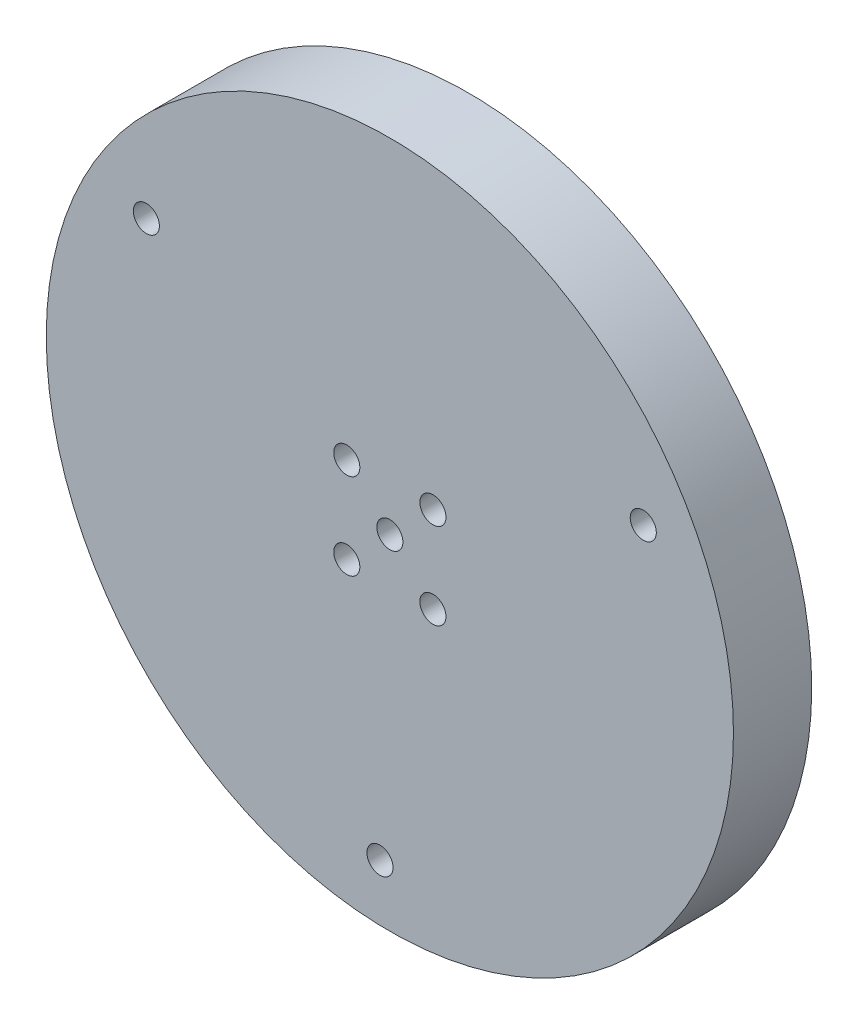
ISO-10303-21;
HEADER;
FILE_DESCRIPTION(('STEP AP214'),'2;1');
FILE_NAME('part.step','',(''),(''),'','','');
FILE_SCHEMA(('AUTOMOTIVE_DESIGN { 1 0 10303 214 1 1 1 1 }'));
ENDSEC;
DATA;
#1=APPLICATION_CONTEXT('core data for automotive mechanical design processes');
#2=APPLICATION_PROTOCOL_DEFINITION('international standard','automotive_design',2000,#1);
#3=PRODUCT_CONTEXT('',#1,'mechanical');
#4=PRODUCT('Part','Part','',(#3));
#5=PRODUCT_RELATED_PRODUCT_CATEGORY('part','',(#4));
#6=PRODUCT_DEFINITION_FORMATION('','',#4);
#7=PRODUCT_DEFINITION_CONTEXT('part definition',#1,'design');
#8=PRODUCT_DEFINITION('design','',#6,#7);
#9=PRODUCT_DEFINITION_SHAPE('','',#8);
#10=(LENGTH_UNIT() NAMED_UNIT(*) SI_UNIT(.MILLI.,.METRE.));
#11=(NAMED_UNIT(*) PLANE_ANGLE_UNIT() SI_UNIT($,.RADIAN.));
#12=(NAMED_UNIT(*) SI_UNIT($,.STERADIAN.) SOLID_ANGLE_UNIT());
#13=UNCERTAINTY_MEASURE_WITH_UNIT(LENGTH_MEASURE(1.E-05),#10,'distance_accuracy_value','');
#14=(GEOMETRIC_REPRESENTATION_CONTEXT(3) GLOBAL_UNCERTAINTY_ASSIGNED_CONTEXT((#13)) GLOBAL_UNIT_ASSIGNED_CONTEXT((#10,
#11,#12)) REPRESENTATION_CONTEXT('',''));
#15=CARTESIAN_POINT('',(0.,0.,0.));
#16=DIRECTION('',(0.,0.,1.));
#17=DIRECTION('',(1.,0.,0.));
#18=AXIS2_PLACEMENT_3D('',#15,#16,#17);
#19=CARTESIAN_POINT('',(0.,0.,9.));
#20=DIRECTION('',(0.,0.,-1.));
#21=DIRECTION('',(-1.,0.,0.));
#22=AXIS2_PLACEMENT_3D('',#19,#20,#21);
#23=CYLINDRICAL_SURFACE('',#22,39.5);
#24=CARTESIAN_POINT('',(0.,0.,9.));
#25=DIRECTION('',(0.,0.,1.));
#26=DIRECTION('',(1.,0.,0.));
#27=AXIS2_PLACEMENT_3D('',#24,#25,#26);
#28=CIRCLE('',#27,39.5);
#29=CARTESIAN_POINT('',(39.5,0.,9.));
#30=VERTEX_POINT('',#29);
#31=EDGE_CURVE('E10',#30,#30,#28,.T.);
#32=ORIENTED_EDGE('',*,*,#31,.F.);
#33=EDGE_LOOP('',(#32));
#34=FACE_BOUND('',#33,.T.);
#35=CARTESIAN_POINT('',(0.,0.,0.));
#36=DIRECTION('',(0.,0.,1.));
#37=DIRECTION('',(1.,0.,0.));
#38=AXIS2_PLACEMENT_3D('',#35,#36,#37);
#39=CIRCLE('',#38,39.5);
#40=CARTESIAN_POINT('',(39.5,0.,0.));
#41=VERTEX_POINT('',#40);
#42=EDGE_CURVE('E34',#41,#41,#39,.T.);
#43=ORIENTED_EDGE('',*,*,#42,.T.);
#44=EDGE_LOOP('',(#43));
#45=FACE_BOUND('',#44,.T.);
#46=ADVANCED_FACE('F31',(#34,#45),#23,.T.);
#47=CARTESIAN_POINT('',(0.,0.,9.));
#48=DIRECTION('',(0.,0.,1.));
#49=DIRECTION('',(1.,0.,0.));
#50=AXIS2_PLACEMENT_3D('',#47,#48,#49);
#51=PLANE('',#50);
#52=CARTESIAN_POINT('',(4.94974746830583,-4.94974746830592,9.));
#53=DIRECTION('',(0.,0.,-1.));
#54=DIRECTION('',(-1.,0.,0.));
#55=AXIS2_PLACEMENT_3D('',#52,#53,#54);
#56=CIRCLE('',#55,1.5);
#57=CARTESIAN_POINT('',(3.44974746830583,-4.94974746830592,9.));
#58=VERTEX_POINT('',#57);
#59=EDGE_CURVE('E76',#58,#58,#56,.T.);
#60=ORIENTED_EDGE('',*,*,#59,.T.);
#61=EDGE_LOOP('',(#60));
#62=FACE_BOUND('',#61,.T.);
#63=CARTESIAN_POINT('',(-4.94974746830583,-4.94974746830583,9.));
#64=DIRECTION('',(0.,0.,-1.));
#65=DIRECTION('',(-1.,0.,0.));
#66=AXIS2_PLACEMENT_3D('',#63,#64,#65);
#67=CIRCLE('',#66,1.5);
#68=CARTESIAN_POINT('',(-6.44974746830583,-4.94974746830583,9.));
#69=VERTEX_POINT('',#68);
#70=EDGE_CURVE('E82',#69,#69,#67,.T.);
#71=ORIENTED_EDGE('',*,*,#70,.T.);
#72=EDGE_LOOP('',(#71));
#73=FACE_BOUND('',#72,.T.);
#74=CARTESIAN_POINT('',(-4.94974746830582,4.94974746830583,9.));
#75=DIRECTION('',(0.,0.,-1.));
#76=DIRECTION('',(-1.,0.,0.));
#77=AXIS2_PLACEMENT_3D('',#74,#75,#76);
#78=CIRCLE('',#77,1.5);
#79=CARTESIAN_POINT('',(-6.44974746830582,4.94974746830583,9.));
#80=VERTEX_POINT('',#79);
#81=EDGE_CURVE('E88',#80,#80,#78,.T.);
#82=ORIENTED_EDGE('',*,*,#81,.T.);
#83=EDGE_LOOP('',(#82));
#84=FACE_BOUND('',#83,.T.);
#85=CARTESIAN_POINT('',(4.94974746830583,4.94974746830583,9.));
#86=DIRECTION('',(0.,0.,-1.));
#87=DIRECTION('',(-1.,0.,0.));
#88=AXIS2_PLACEMENT_3D('',#85,#86,#87);
#89=CIRCLE('',#88,1.5);
#90=CARTESIAN_POINT('',(3.44974746830583,4.94974746830583,9.));
#91=VERTEX_POINT('',#90);
#92=EDGE_CURVE('E70',#91,#91,#89,.T.);
#93=ORIENTED_EDGE('',*,*,#92,.T.);
#94=EDGE_LOOP('',(#93));
#95=FACE_BOUND('',#94,.T.);
#96=CARTESIAN_POINT('',(0.,0.,9.));
#97=DIRECTION('',(0.,0.,-1.));
#98=DIRECTION('',(-1.,0.,0.));
#99=AXIS2_PLACEMENT_3D('',#96,#97,#98);
#100=CIRCLE('',#99,1.5);
#101=CARTESIAN_POINT('',(-1.5,0.,9.));
#102=VERTEX_POINT('',#101);
#103=EDGE_CURVE('E53',#102,#102,#100,.T.);
#104=ORIENTED_EDGE('',*,*,#103,.T.);
#105=EDGE_LOOP('',(#104));
#106=FACE_BOUND('',#105,.T.);
#107=CARTESIAN_POINT('',(-1.13671612839396,-32.9804165595805,9.));
#108=DIRECTION('',(0.,0.,-1.));
#109=DIRECTION('',(-1.,0.,0.));
#110=AXIS2_PLACEMENT_3D('',#107,#108,#109);
#111=CIRCLE('',#110,1.5);
#112=CARTESIAN_POINT('',(-2.63671612839396,-32.9804165595805,9.));
#113=VERTEX_POINT('',#112);
#114=EDGE_CURVE('E46',#113,#113,#111,.T.);
#115=ORIENTED_EDGE('',*,*,#114,.T.);
#116=EDGE_LOOP('',(#115));
#117=FACE_BOUND('',#116,.T.);
#118=CARTESIAN_POINT('',(29.1302366321866,15.5057832357097,9.));
#119=DIRECTION('',(0.,0.,-1.));
#120=DIRECTION('',(-1.,0.,0.));
#121=AXIS2_PLACEMENT_3D('',#118,#119,#120);
#122=CIRCLE('',#121,1.5);
#123=CARTESIAN_POINT('',(27.6302366321866,15.5057832357097,9.));
#124=VERTEX_POINT('',#123);
#125=EDGE_CURVE('E59',#124,#124,#122,.T.);
#126=ORIENTED_EDGE('',*,*,#125,.T.);
#127=EDGE_LOOP('',(#126));
#128=FACE_BOUND('',#127,.T.);
#129=CARTESIAN_POINT('',(-27.9935205037928,17.4746333238706,9.));
#130=DIRECTION('',(0.,0.,-1.));
#131=DIRECTION('',(-1.,0.,0.));
#132=AXIS2_PLACEMENT_3D('',#129,#130,#131);
#133=CIRCLE('',#132,1.5);
#134=CARTESIAN_POINT('',(-29.4935205037928,17.4746333238706,9.));
#135=VERTEX_POINT('',#134);
#136=EDGE_CURVE('E52',#135,#135,#133,.T.);
#137=ORIENTED_EDGE('',*,*,#136,.T.);
#138=EDGE_LOOP('',(#137));
#139=FACE_BOUND('',#138,.T.);
#140=ORIENTED_EDGE('',*,*,#31,.T.);
#141=EDGE_LOOP('',(#140));
#142=FACE_BOUND('',#141,.T.);
#143=ADVANCED_FACE('F97',(#62,#73,#84,#95,#106,#117,#128,#139,#142),#51,.T.);
#144=CARTESIAN_POINT('',(0.,0.,0.));
#145=DIRECTION('',(0.,0.,1.));
#146=DIRECTION('',(1.,0.,0.));
#147=AXIS2_PLACEMENT_3D('',#144,#145,#146);
#148=PLANE('',#147);
#149=CARTESIAN_POINT('',(-1.13671612839396,-32.9804165595805,0.));
#150=DIRECTION('',(0.,0.,-1.));
#151=DIRECTION('',(-1.,0.,0.));
#152=AXIS2_PLACEMENT_3D('',#149,#150,#151);
#153=CIRCLE('',#152,1.5);
#154=CARTESIAN_POINT('',(-2.63671612839396,-32.9804165595805,0.));
#155=VERTEX_POINT('',#154);
#156=EDGE_CURVE('E62',#155,#155,#153,.T.);
#157=ORIENTED_EDGE('',*,*,#156,.F.);
#158=EDGE_LOOP('',(#157));
#159=FACE_BOUND('',#158,.T.);
#160=CARTESIAN_POINT('',(29.1302366321866,15.5057832357097,0.));
#161=DIRECTION('',(0.,0.,-1.));
#162=DIRECTION('',(-1.,0.,0.));
#163=AXIS2_PLACEMENT_3D('',#160,#161,#162);
#164=CIRCLE('',#163,1.5);
#165=CARTESIAN_POINT('',(27.6302366321866,15.5057832357097,0.));
#166=VERTEX_POINT('',#165);
#167=EDGE_CURVE('E56',#166,#166,#164,.T.);
#168=ORIENTED_EDGE('',*,*,#167,.F.);
#169=EDGE_LOOP('',(#168));
#170=FACE_BOUND('',#169,.T.);
#171=CARTESIAN_POINT('',(-27.9935205037928,17.4746333238706,0.));
#172=DIRECTION('',(0.,0.,-1.));
#173=DIRECTION('',(-1.,0.,0.));
#174=AXIS2_PLACEMENT_3D('',#171,#172,#173);
#175=CIRCLE('',#174,1.5);
#176=CARTESIAN_POINT('',(-29.4935205037928,17.4746333238706,0.));
#177=VERTEX_POINT('',#176);
#178=EDGE_CURVE('E49',#177,#177,#175,.T.);
#179=ORIENTED_EDGE('',*,*,#178,.F.);
#180=EDGE_LOOP('',(#179));
#181=FACE_BOUND('',#180,.T.);
#182=CARTESIAN_POINT('',(0.,0.,0.));
#183=DIRECTION('',(0.,0.,-1.));
#184=DIRECTION('',(-1.,0.,0.));
#185=AXIS2_PLACEMENT_3D('',#182,#183,#184);
#186=CIRCLE('',#185,20.);
#187=CARTESIAN_POINT('',(-20.,0.,0.));
#188=VERTEX_POINT('',#187);
#189=EDGE_CURVE('E43',#188,#188,#186,.T.);
#190=ORIENTED_EDGE('',*,*,#189,.F.);
#191=EDGE_LOOP('',(#190));
#192=FACE_BOUND('',#191,.T.);
#193=ORIENTED_EDGE('',*,*,#42,.F.);
#194=EDGE_LOOP('',(#193));
#195=FACE_BOUND('',#194,.T.);
#196=ADVANCED_FACE('F121',(#159,#170,#181,#192,#195),#148,.F.);
#197=CARTESIAN_POINT('',(0.,0.,5.));
#198=DIRECTION('',(0.,0.,-1.));
#199=DIRECTION('',(-1.,0.,0.));
#200=AXIS2_PLACEMENT_3D('',#197,#198,#199);
#201=CYLINDRICAL_SURFACE('',#200,20.);
#202=CARTESIAN_POINT('',(0.,0.,5.));
#203=DIRECTION('',(0.,0.,-1.));
#204=DIRECTION('',(-1.,0.,0.));
#205=AXIS2_PLACEMENT_3D('',#202,#203,#204);
#206=CIRCLE('',#205,20.);
#207=CARTESIAN_POINT('',(-20.,0.,5.));
#208=VERTEX_POINT('',#207);
#209=EDGE_CURVE('E41',#208,#208,#206,.T.);
#210=ORIENTED_EDGE('',*,*,#209,.F.);
#211=EDGE_LOOP('',(#210));
#212=FACE_BOUND('',#211,.T.);
#213=ORIENTED_EDGE('',*,*,#189,.T.);
#214=EDGE_LOOP('',(#213));
#215=FACE_BOUND('',#214,.T.);
#216=ADVANCED_FACE('F112',(#212,#215),#201,.F.);
#217=CARTESIAN_POINT('',(0.,0.,5.));
#218=DIRECTION('',(0.,0.,-1.));
#219=DIRECTION('',(-1.,0.,0.));
#220=AXIS2_PLACEMENT_3D('',#217,#218,#219);
#221=PLANE('',#220);
#222=CARTESIAN_POINT('',(4.94974746830583,-4.94974746830592,5.));
#223=DIRECTION('',(0.,0.,-1.));
#224=DIRECTION('',(-1.,0.,0.));
#225=AXIS2_PLACEMENT_3D('',#222,#223,#224);
#226=CIRCLE('',#225,1.5);
#227=CARTESIAN_POINT('',(3.44974746830583,-4.94974746830592,5.));
#228=VERTEX_POINT('',#227);
#229=EDGE_CURVE('E73',#228,#228,#226,.T.);
#230=ORIENTED_EDGE('',*,*,#229,.F.);
#231=EDGE_LOOP('',(#230));
#232=FACE_BOUND('',#231,.T.);
#233=CARTESIAN_POINT('',(-4.94974746830583,-4.94974746830583,5.));
#234=DIRECTION('',(0.,0.,-1.));
#235=DIRECTION('',(-1.,0.,0.));
#236=AXIS2_PLACEMENT_3D('',#233,#234,#235);
#237=CIRCLE('',#236,1.5);
#238=CARTESIAN_POINT('',(-6.44974746830583,-4.94974746830583,5.));
#239=VERTEX_POINT('',#238);
#240=EDGE_CURVE('E79',#239,#239,#237,.T.);
#241=ORIENTED_EDGE('',*,*,#240,.F.);
#242=EDGE_LOOP('',(#241));
#243=FACE_BOUND('',#242,.T.);
#244=CARTESIAN_POINT('',(-4.94974746830582,4.94974746830583,5.));
#245=DIRECTION('',(0.,0.,-1.));
#246=DIRECTION('',(-1.,0.,0.));
#247=AXIS2_PLACEMENT_3D('',#244,#245,#246);
#248=CIRCLE('',#247,1.5);
#249=CARTESIAN_POINT('',(-6.44974746830582,4.94974746830583,5.));
#250=VERTEX_POINT('',#249);
#251=EDGE_CURVE('E85',#250,#250,#248,.T.);
#252=ORIENTED_EDGE('',*,*,#251,.F.);
#253=EDGE_LOOP('',(#252));
#254=FACE_BOUND('',#253,.T.);
#255=CARTESIAN_POINT('',(4.94974746830583,4.94974746830583,5.));
#256=DIRECTION('',(0.,0.,-1.));
#257=DIRECTION('',(-1.,0.,0.));
#258=AXIS2_PLACEMENT_3D('',#255,#256,#257);
#259=CIRCLE('',#258,1.5);
#260=CARTESIAN_POINT('',(3.44974746830583,4.94974746830583,5.));
#261=VERTEX_POINT('',#260);
#262=EDGE_CURVE('E91',#261,#261,#259,.T.);
#263=ORIENTED_EDGE('',*,*,#262,.F.);
#264=EDGE_LOOP('',(#263));
#265=FACE_BOUND('',#264,.T.);
#266=CARTESIAN_POINT('',(0.,0.,5.));
#267=DIRECTION('',(0.,0.,-1.));
#268=DIRECTION('',(-1.,0.,0.));
#269=AXIS2_PLACEMENT_3D('',#266,#267,#268);
#270=CIRCLE('',#269,1.5);
#271=CARTESIAN_POINT('',(-1.5,0.,5.));
#272=VERTEX_POINT('',#271);
#273=EDGE_CURVE('E67',#272,#272,#270,.T.);
#274=ORIENTED_EDGE('',*,*,#273,.F.);
#275=EDGE_LOOP('',(#274));
#276=FACE_BOUND('',#275,.T.);
#277=ORIENTED_EDGE('',*,*,#209,.T.);
#278=EDGE_LOOP('',(#277));
#279=FACE_BOUND('',#278,.T.);
#280=ADVANCED_FACE('F108',(#232,#243,#254,#265,#276,#279),#221,.T.);
#281=CARTESIAN_POINT('',(-27.9935205037928,17.4746333238706,9.));
#282=DIRECTION('',(0.,0.,-1.));
#283=DIRECTION('',(-1.,0.,0.));
#284=AXIS2_PLACEMENT_3D('',#281,#282,#283);
#285=CYLINDRICAL_SURFACE('',#284,1.5);
#286=ORIENTED_EDGE('',*,*,#136,.F.);
#287=EDGE_LOOP('',(#286));
#288=FACE_BOUND('',#287,.T.);
#289=ORIENTED_EDGE('',*,*,#178,.T.);
#290=EDGE_LOOP('',(#289));
#291=FACE_BOUND('',#290,.T.);
#292=ADVANCED_FACE('F111',(#288,#291),#285,.F.);
#293=CARTESIAN_POINT('',(29.1302366321866,15.5057832357097,9.));
#294=DIRECTION('',(0.,0.,-1.));
#295=DIRECTION('',(-1.,0.,0.));
#296=AXIS2_PLACEMENT_3D('',#293,#294,#295);
#297=CYLINDRICAL_SURFACE('',#296,1.5);
#298=ORIENTED_EDGE('',*,*,#125,.F.);
#299=EDGE_LOOP('',(#298));
#300=FACE_BOUND('',#299,.T.);
#301=ORIENTED_EDGE('',*,*,#167,.T.);
#302=EDGE_LOOP('',(#301));
#303=FACE_BOUND('',#302,.T.);
#304=ADVANCED_FACE('F143',(#300,#303),#297,.F.);
#305=CARTESIAN_POINT('',(-1.13671612839396,-32.9804165595805,9.));
#306=DIRECTION('',(0.,0.,-1.));
#307=DIRECTION('',(-1.,0.,0.));
#308=AXIS2_PLACEMENT_3D('',#305,#306,#307);
#309=CYLINDRICAL_SURFACE('',#308,1.5);
#310=ORIENTED_EDGE('',*,*,#114,.F.);
#311=EDGE_LOOP('',(#310));
#312=FACE_BOUND('',#311,.T.);
#313=ORIENTED_EDGE('',*,*,#156,.T.);
#314=EDGE_LOOP('',(#313));
#315=FACE_BOUND('',#314,.T.);
#316=ADVANCED_FACE('F147',(#312,#315),#309,.F.);
#317=CARTESIAN_POINT('',(0.,0.,9.));
#318=DIRECTION('',(0.,0.,-1.));
#319=DIRECTION('',(-1.,0.,0.));
#320=AXIS2_PLACEMENT_3D('',#317,#318,#319);
#321=CYLINDRICAL_SURFACE('',#320,1.5);
#322=ORIENTED_EDGE('',*,*,#103,.F.);
#323=EDGE_LOOP('',(#322));
#324=FACE_BOUND('',#323,.T.);
#325=ORIENTED_EDGE('',*,*,#273,.T.);
#326=EDGE_LOOP('',(#325));
#327=FACE_BOUND('',#326,.T.);
#328=ADVANCED_FACE('F104',(#324,#327),#321,.F.);
#329=CARTESIAN_POINT('',(4.94974746830583,4.94974746830583,9.));
#330=DIRECTION('',(0.,0.,-1.));
#331=DIRECTION('',(-1.,0.,0.));
#332=AXIS2_PLACEMENT_3D('',#329,#330,#331);
#333=CYLINDRICAL_SURFACE('',#332,1.5);
#334=ORIENTED_EDGE('',*,*,#92,.F.);
#335=EDGE_LOOP('',(#334));
#336=FACE_BOUND('',#335,.T.);
#337=ORIENTED_EDGE('',*,*,#262,.T.);
#338=EDGE_LOOP('',(#337));
#339=FACE_BOUND('',#338,.T.);
#340=ADVANCED_FACE('F100',(#336,#339),#333,.F.);
#341=CARTESIAN_POINT('',(-4.94974746830582,4.94974746830583,9.));
#342=DIRECTION('',(0.,0.,-1.));
#343=DIRECTION('',(-1.,0.,0.));
#344=AXIS2_PLACEMENT_3D('',#341,#342,#343);
#345=CYLINDRICAL_SURFACE('',#344,1.5);
#346=ORIENTED_EDGE('',*,*,#81,.F.);
#347=EDGE_LOOP('',(#346));
#348=FACE_BOUND('',#347,.T.);
#349=ORIENTED_EDGE('',*,*,#251,.T.);
#350=EDGE_LOOP('',(#349));
#351=FACE_BOUND('',#350,.T.);
#352=ADVANCED_FACE('F103',(#348,#351),#345,.F.);
#353=CARTESIAN_POINT('',(-4.94974746830583,-4.94974746830583,9.));
#354=DIRECTION('',(0.,0.,-1.));
#355=DIRECTION('',(-1.,0.,0.));
#356=AXIS2_PLACEMENT_3D('',#353,#354,#355);
#357=CYLINDRICAL_SURFACE('',#356,1.5);
#358=ORIENTED_EDGE('',*,*,#70,.F.);
#359=EDGE_LOOP('',(#358));
#360=FACE_BOUND('',#359,.T.);
#361=ORIENTED_EDGE('',*,*,#240,.T.);
#362=EDGE_LOOP('',(#361));
#363=FACE_BOUND('',#362,.T.);
#364=ADVANCED_FACE('F158',(#360,#363),#357,.F.);
#365=CARTESIAN_POINT('',(4.94974746830583,-4.94974746830592,9.));
#366=DIRECTION('',(0.,0.,-1.));
#367=DIRECTION('',(-1.,0.,0.));
#368=AXIS2_PLACEMENT_3D('',#365,#366,#367);
#369=CYLINDRICAL_SURFACE('',#368,1.5);
#370=ORIENTED_EDGE('',*,*,#59,.F.);
#371=EDGE_LOOP('',(#370));
#372=FACE_BOUND('',#371,.T.);
#373=ORIENTED_EDGE('',*,*,#229,.T.);
#374=EDGE_LOOP('',(#373));
#375=FACE_BOUND('',#374,.T.);
#376=ADVANCED_FACE('F155',(#372,#375),#369,.F.);
#377=CLOSED_SHELL('',(#46,#143,#196,#216,#280,#292,#304,#316,#328,#340,#352,#364,#376));
#378=MANIFOLD_SOLID_BREP('B2',#377);
#379=ADVANCED_BREP_SHAPE_REPRESENTATION('',(#18,#378),#14);
#380=SHAPE_DEFINITION_REPRESENTATION(#9,#379);
ENDSEC;
END-ISO-10303-21;
